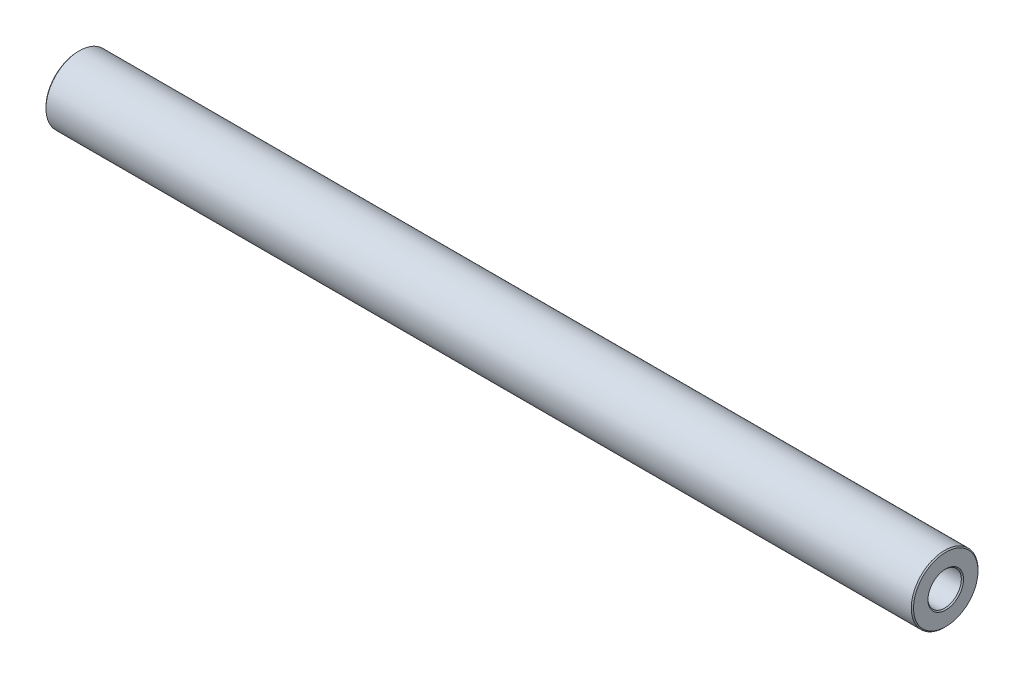
ISO-10303-21;
HEADER;
FILE_DESCRIPTION(('STEP AP214'),'2;1');
FILE_NAME('part.step','',(''),(''),'','','');
FILE_SCHEMA(('AUTOMOTIVE_DESIGN { 1 0 10303 214 1 1 1 1 }'));
ENDSEC;
DATA;
#1=APPLICATION_CONTEXT('core data for automotive mechanical design processes');
#2=APPLICATION_PROTOCOL_DEFINITION('international standard','automotive_design',2000,#1);
#3=PRODUCT_CONTEXT('',#1,'mechanical');
#4=PRODUCT('Part','Part','',(#3));
#5=PRODUCT_RELATED_PRODUCT_CATEGORY('part','',(#4));
#6=PRODUCT_DEFINITION_FORMATION('','',#4);
#7=PRODUCT_DEFINITION_CONTEXT('part definition',#1,'design');
#8=PRODUCT_DEFINITION('design','',#6,#7);
#9=PRODUCT_DEFINITION_SHAPE('','',#8);
#10=(LENGTH_UNIT() NAMED_UNIT(*) SI_UNIT(.MILLI.,.METRE.));
#11=(NAMED_UNIT(*) PLANE_ANGLE_UNIT() SI_UNIT($,.RADIAN.));
#12=(NAMED_UNIT(*) SI_UNIT($,.STERADIAN.) SOLID_ANGLE_UNIT());
#13=UNCERTAINTY_MEASURE_WITH_UNIT(LENGTH_MEASURE(1.E-05),#10,'distance_accuracy_value','');
#14=(GEOMETRIC_REPRESENTATION_CONTEXT(3) GLOBAL_UNCERTAINTY_ASSIGNED_CONTEXT((#13)) GLOBAL_UNIT_ASSIGNED_CONTEXT((#10,
#11,#12)) REPRESENTATION_CONTEXT('',''));
#15=CARTESIAN_POINT('',(0.,0.,0.));
#16=DIRECTION('',(0.,0.,1.));
#17=DIRECTION('',(1.,0.,0.));
#18=AXIS2_PLACEMENT_3D('',#15,#16,#17);
#19=CARTESIAN_POINT('',(39.,0.,0.));
#20=DIRECTION('',(-1.,0.,0.));
#21=DIRECTION('',(0.,0.,1.));
#22=AXIS2_PLACEMENT_3D('',#19,#20,#21);
#23=CYLINDRICAL_SURFACE('',#22,3.);
#24=CARTESIAN_POINT('',(-38.9,0.,0.));
#25=DIRECTION('',(1.,0.,0.));
#26=DIRECTION('',(0.,0.,-1.));
#27=AXIS2_PLACEMENT_3D('',#24,#25,#26);
#28=CIRCLE('',#27,3.);
#29=CARTESIAN_POINT('',(-38.9,0.,-3.));
#30=VERTEX_POINT('',#29);
#31=EDGE_CURVE('E49',#30,#30,#28,.T.);
#32=ORIENTED_EDGE('',*,*,#31,.T.);
#33=EDGE_LOOP('',(#32));
#34=FACE_BOUND('',#33,.T.);
#35=CARTESIAN_POINT('',(38.9,0.,0.));
#36=DIRECTION('',(1.,0.,0.));
#37=DIRECTION('',(0.,0.,-1.));
#38=AXIS2_PLACEMENT_3D('',#35,#36,#37);
#39=CIRCLE('',#38,3.);
#40=CARTESIAN_POINT('',(38.9,0.,-3.));
#41=VERTEX_POINT('',#40);
#42=EDGE_CURVE('E54',#41,#41,#39,.F.);
#43=ORIENTED_EDGE('',*,*,#42,.T.);
#44=EDGE_LOOP('',(#43));
#45=FACE_BOUND('',#44,.T.);
#46=ADVANCED_FACE('F33',(#34,#45),#23,.T.);
#47=CARTESIAN_POINT('',(39.,0.,0.));
#48=DIRECTION('',(1.,0.,0.));
#49=DIRECTION('',(0.,0.,-1.));
#50=AXIS2_PLACEMENT_3D('',#47,#48,#49);
#51=PLANE('',#50);
#52=CARTESIAN_POINT('',(39.,0.,0.));
#53=DIRECTION('',(1.,0.,0.));
#54=DIRECTION('',(0.,0.,-1.));
#55=AXIS2_PLACEMENT_3D('',#52,#53,#54);
#56=CIRCLE('',#55,1.59999999999999);
#57=CARTESIAN_POINT('',(39.,0.,-1.59999999999999));
#58=VERTEX_POINT('',#57);
#59=EDGE_CURVE('E10',#58,#58,#56,.F.);
#60=ORIENTED_EDGE('',*,*,#59,.T.);
#61=EDGE_LOOP('',(#60));
#62=FACE_BOUND('',#61,.T.);
#63=CARTESIAN_POINT('',(39.,0.,0.));
#64=DIRECTION('',(1.,0.,0.));
#65=DIRECTION('',(0.,0.,-1.));
#66=AXIS2_PLACEMENT_3D('',#63,#64,#65);
#67=CIRCLE('',#66,2.89999999999999);
#68=CARTESIAN_POINT('',(39.,0.,-2.89999999999999));
#69=VERTEX_POINT('',#68);
#70=EDGE_CURVE('E41',#69,#69,#67,.T.);
#71=ORIENTED_EDGE('',*,*,#70,.T.);
#72=EDGE_LOOP('',(#71));
#73=FACE_BOUND('',#72,.T.);
#74=ADVANCED_FACE('F90',(#62,#73),#51,.T.);
#75=CARTESIAN_POINT('',(-39.,0.,0.));
#76=DIRECTION('',(1.,0.,0.));
#77=DIRECTION('',(0.,0.,-1.));
#78=AXIS2_PLACEMENT_3D('',#75,#76,#77);
#79=PLANE('',#78);
#80=CARTESIAN_POINT('',(-39.,0.,0.));
#81=DIRECTION('',(1.,0.,0.));
#82=DIRECTION('',(0.,0.,-1.));
#83=AXIS2_PLACEMENT_3D('',#80,#81,#82);
#84=CIRCLE('',#83,1.59999999999999);
#85=CARTESIAN_POINT('',(-39.,0.,1.59999999999999));
#86=VERTEX_POINT('',#85);
#87=EDGE_CURVE('E57',#86,#86,#84,.T.);
#88=ORIENTED_EDGE('',*,*,#87,.T.);
#89=EDGE_LOOP('',(#88));
#90=FACE_BOUND('',#89,.T.);
#91=CARTESIAN_POINT('',(-39.,0.,0.));
#92=DIRECTION('',(1.,0.,0.));
#93=DIRECTION('',(0.,0.,-1.));
#94=AXIS2_PLACEMENT_3D('',#91,#92,#93);
#95=CIRCLE('',#94,2.90000000000001);
#96=CARTESIAN_POINT('',(-39.,0.,-2.90000000000001));
#97=VERTEX_POINT('',#96);
#98=EDGE_CURVE('E60',#97,#97,#95,.F.);
#99=ORIENTED_EDGE('',*,*,#98,.T.);
#100=EDGE_LOOP('',(#99));
#101=FACE_BOUND('',#100,.T.);
#102=ADVANCED_FACE('F96',(#90,#101),#79,.F.);
#103=CARTESIAN_POINT('',(-32.,0.,0.));
#104=DIRECTION('',(-1.,0.,0.));
#105=DIRECTION('',(0.,0.,1.));
#106=AXIS2_PLACEMENT_3D('',#103,#104,#105);
#107=CYLINDRICAL_SURFACE('',#106,1.5);
#108=CARTESIAN_POINT('',(-38.9,0.,0.));
#109=DIRECTION('',(1.,0.,0.));
#110=DIRECTION('',(0.,0.,-1.));
#111=AXIS2_PLACEMENT_3D('',#108,#109,#110);
#112=CIRCLE('',#111,1.5);
#113=CARTESIAN_POINT('',(-38.9,0.,1.5));
#114=VERTEX_POINT('',#113);
#115=EDGE_CURVE('E63',#114,#114,#112,.F.);
#116=ORIENTED_EDGE('',*,*,#115,.T.);
#117=EDGE_LOOP('',(#116));
#118=FACE_BOUND('',#117,.T.);
#119=CARTESIAN_POINT('',(-32.,0.,0.));
#120=DIRECTION('',(-1.,0.,0.));
#121=DIRECTION('',(0.,0.,1.));
#122=AXIS2_PLACEMENT_3D('',#119,#120,#121);
#123=CIRCLE('',#122,1.5);
#124=CARTESIAN_POINT('',(-32.,0.,1.5));
#125=VERTEX_POINT('',#124);
#126=EDGE_CURVE('E66',#125,#125,#123,.T.);
#127=ORIENTED_EDGE('',*,*,#126,.F.);
#128=EDGE_LOOP('',(#127));
#129=FACE_BOUND('',#128,.T.);
#130=ADVANCED_FACE('F86',(#118,#129),#107,.F.);
#131=CARTESIAN_POINT('',(-32.,0.,0.));
#132=DIRECTION('',(-1.,0.,0.));
#133=DIRECTION('',(0.,0.,1.));
#134=AXIS2_PLACEMENT_3D('',#131,#132,#133);
#135=PLANE('',#134);
#136=ORIENTED_EDGE('',*,*,#126,.T.);
#137=EDGE_LOOP('',(#136));
#138=FACE_BOUND('',#137,.T.);
#139=ADVANCED_FACE('F77',(#138),#135,.T.);
#140=CARTESIAN_POINT('',(32.,0.,0.));
#141=DIRECTION('',(1.,0.,0.));
#142=DIRECTION('',(0.,0.,-1.));
#143=AXIS2_PLACEMENT_3D('',#140,#141,#142);
#144=CYLINDRICAL_SURFACE('',#143,1.5);
#145=CARTESIAN_POINT('',(38.9,0.,0.));
#146=DIRECTION('',(1.,0.,0.));
#147=DIRECTION('',(0.,0.,-1.));
#148=AXIS2_PLACEMENT_3D('',#145,#146,#147);
#149=CIRCLE('',#148,1.5);
#150=CARTESIAN_POINT('',(38.9,0.,-1.5));
#151=VERTEX_POINT('',#150);
#152=EDGE_CURVE('E45',#151,#151,#149,.T.);
#153=ORIENTED_EDGE('',*,*,#152,.T.);
#154=EDGE_LOOP('',(#153));
#155=FACE_BOUND('',#154,.T.);
#156=CARTESIAN_POINT('',(32.,0.,0.));
#157=DIRECTION('',(1.,0.,0.));
#158=DIRECTION('',(0.,0.,-1.));
#159=AXIS2_PLACEMENT_3D('',#156,#157,#158);
#160=CIRCLE('',#159,1.5);
#161=CARTESIAN_POINT('',(32.,0.,-1.5));
#162=VERTEX_POINT('',#161);
#163=EDGE_CURVE('E69',#162,#162,#160,.T.);
#164=ORIENTED_EDGE('',*,*,#163,.F.);
#165=EDGE_LOOP('',(#164));
#166=FACE_BOUND('',#165,.T.);
#167=ADVANCED_FACE('F75',(#155,#166),#144,.F.);
#168=CARTESIAN_POINT('',(32.,0.,0.));
#169=DIRECTION('',(1.,0.,0.));
#170=DIRECTION('',(0.,0.,-1.));
#171=AXIS2_PLACEMENT_3D('',#168,#169,#170);
#172=PLANE('',#171);
#173=ORIENTED_EDGE('',*,*,#163,.T.);
#174=EDGE_LOOP('',(#173));
#175=FACE_BOUND('',#174,.T.);
#176=ADVANCED_FACE('F73',(#175),#172,.T.);
#177=CARTESIAN_POINT('',(-38.9,0.,0.));
#178=DIRECTION('',(-1.,0.,0.));
#179=DIRECTION('',(0.,0.,1.));
#180=AXIS2_PLACEMENT_3D('',#177,#178,#179);
#181=CONICAL_SURFACE('',#180,1.5,0.785398163397454);
#182=CARTESIAN_POINT('',(-39.,0.,1.59999999999999));
#183=CARTESIAN_POINT('',(-38.9989583333333,0.,1.59895833333333));
#184=CARTESIAN_POINT('',(-38.9979166666667,0.,1.59791666666666));
#185=CARTESIAN_POINT('',(-38.9958333333333,0.,1.59583333333333));
#186=CARTESIAN_POINT('',(-38.9947916666667,0.,1.59479166666666));
#187=CARTESIAN_POINT('',(-38.9927083333333,0.,1.59270833333333));
#188=CARTESIAN_POINT('',(-38.9916666666667,0.,1.59166666666666));
#189=CARTESIAN_POINT('',(-38.9895833333333,0.,1.58958333333333));
#190=CARTESIAN_POINT('',(-38.9885416666667,0.,1.58854166666666));
#191=CARTESIAN_POINT('',(-38.9864583333333,0.,1.58645833333333));
#192=CARTESIAN_POINT('',(-38.9854166666667,0.,1.58541666666666));
#193=CARTESIAN_POINT('',(-38.9833333333333,0.,1.58333333333333));
#194=CARTESIAN_POINT('',(-38.9822916666667,0.,1.58229166666666));
#195=CARTESIAN_POINT('',(-38.9802083333333,0.,1.58020833333333));
#196=CARTESIAN_POINT('',(-38.9791666666667,0.,1.57916666666666));
#197=CARTESIAN_POINT('',(-38.9770833333333,0.,1.57708333333333));
#198=CARTESIAN_POINT('',(-38.9760416666667,0.,1.57604166666666));
#199=CARTESIAN_POINT('',(-38.9739583333333,0.,1.57395833333333));
#200=CARTESIAN_POINT('',(-38.9729166666667,0.,1.57291666666666));
#201=CARTESIAN_POINT('',(-38.9708333333333,0.,1.57083333333333));
#202=CARTESIAN_POINT('',(-38.9697916666667,0.,1.56979166666666));
#203=CARTESIAN_POINT('',(-38.9677083333333,0.,1.56770833333333));
#204=CARTESIAN_POINT('',(-38.9666666666667,0.,1.56666666666666));
#205=CARTESIAN_POINT('',(-38.9645833333333,0.,1.56458333333333));
#206=CARTESIAN_POINT('',(-38.9635416666667,0.,1.56354166666666));
#207=CARTESIAN_POINT('',(-38.9614583333333,0.,1.56145833333333));
#208=CARTESIAN_POINT('',(-38.9604166666667,0.,1.56041666666666));
#209=CARTESIAN_POINT('',(-38.9583333333333,0.,1.55833333333333));
#210=CARTESIAN_POINT('',(-38.9572916666667,0.,1.55729166666666));
#211=CARTESIAN_POINT('',(-38.9552083333333,0.,1.55520833333333));
#212=CARTESIAN_POINT('',(-38.9541666666667,0.,1.55416666666667));
#213=CARTESIAN_POINT('',(-38.9520833333333,0.,1.55208333333333));
#214=CARTESIAN_POINT('',(-38.9510416666667,0.,1.55104166666667));
#215=CARTESIAN_POINT('',(-38.9489583333333,0.,1.54895833333333));
#216=CARTESIAN_POINT('',(-38.9479166666667,0.,1.54791666666667));
#217=CARTESIAN_POINT('',(-38.9458333333333,0.,1.54583333333333));
#218=CARTESIAN_POINT('',(-38.9447916666667,0.,1.54479166666667));
#219=CARTESIAN_POINT('',(-38.9427083333333,0.,1.54270833333333));
#220=CARTESIAN_POINT('',(-38.9416666666667,0.,1.54166666666667));
#221=CARTESIAN_POINT('',(-38.9395833333333,0.,1.53958333333333));
#222=CARTESIAN_POINT('',(-38.9385416666667,0.,1.53854166666667));
#223=CARTESIAN_POINT('',(-38.9364583333333,0.,1.53645833333333));
#224=CARTESIAN_POINT('',(-38.9354166666667,0.,1.53541666666667));
#225=CARTESIAN_POINT('',(-38.9333333333333,0.,1.53333333333333));
#226=CARTESIAN_POINT('',(-38.9322916666667,0.,1.53229166666667));
#227=CARTESIAN_POINT('',(-38.9302083333333,0.,1.53020833333333));
#228=CARTESIAN_POINT('',(-38.9291666666667,0.,1.52916666666667));
#229=CARTESIAN_POINT('',(-38.9270833333333,0.,1.52708333333333));
#230=CARTESIAN_POINT('',(-38.9260416666667,0.,1.52604166666667));
#231=CARTESIAN_POINT('',(-38.9239583333333,0.,1.52395833333333));
#232=CARTESIAN_POINT('',(-38.9229166666667,0.,1.52291666666667));
#233=CARTESIAN_POINT('',(-38.9208333333333,0.,1.52083333333334));
#234=CARTESIAN_POINT('',(-38.9197916666667,0.,1.51979166666667));
#235=CARTESIAN_POINT('',(-38.9177083333333,0.,1.51770833333334));
#236=CARTESIAN_POINT('',(-38.9166666666667,0.,1.51666666666667));
#237=CARTESIAN_POINT('',(-38.9145833333333,0.,1.51458333333334));
#238=CARTESIAN_POINT('',(-38.9135416666667,0.,1.51354166666667));
#239=CARTESIAN_POINT('',(-38.9114583333333,0.,1.51145833333334));
#240=CARTESIAN_POINT('',(-38.9104166666667,0.,1.51041666666667));
#241=CARTESIAN_POINT('',(-38.9083333333333,0.,1.50833333333334));
#242=CARTESIAN_POINT('',(-38.9072916666667,0.,1.50729166666667));
#243=CARTESIAN_POINT('',(-38.9052083333333,0.,1.50520833333334));
#244=CARTESIAN_POINT('',(-38.9041666666667,0.,1.50416666666667));
#245=CARTESIAN_POINT('',(-38.9020833333333,0.,1.50208333333334));
#246=CARTESIAN_POINT('',(-38.9010416666667,0.,1.50104166666667));
#247=CARTESIAN_POINT('',(-38.9,0.,1.5));
#248=B_SPLINE_CURVE_WITH_KNOTS('',3,(#182,#183,#184,#185,#186,#187,#188,#189,#190,#191,#192,
#193,#194,#195,#196,#197,#198,#199,#200,#201,#202,#203,#204,#205,#206,#207,#208,#209,#210,#211,
#212,#213,#214,#215,#216,#217,#218,#219,#220,#221,#222,#223,#224,#225,#226,#227,#228,#229,#230,
#231,#232,#233,#234,#235,#236,#237,#238,#239,#240,#241,#242,#243,#244,#245,#246,#247),
.UNSPECIFIED.,.F.,.F.,(4,2,2,2,2,2,2,2,2,2,2,2,2,2,2,2,2,2,2,2,2,2,2,2,2,2,2,2,2,2,2,2,4),(0.,
0.00441941738241544,0.00883883476483087,0.0132582521472463,0.0176776695296619,
0.0220970869120773,0.0265165042944928,0.0309359216769082,0.0353553390593236,0.0397747564417391,
0.0441941738241547,0.0486135912065701,0.0530330085889855,0.057452425971401,0.0618718433538164,
0.0662912607362318,0.0707106781186473,0.0751300955010629,0.0795495128834783,0.0839689302658937,
0.0883883476483092,0.0928077650307246,0.0972271824131401,0.101646599795556,0.106066017177971,
0.110485434560387,0.114904851942802,0.119324269325217,0.123743686707633,0.128163104090048,
0.132582521472464,0.137001938854879,0.141421356237295),.UNSPECIFIED.);
#249=EDGE_CURVE('BSEAM84',#86,#114,#248,.T.);
#250=ORIENTED_EDGE('',*,*,#87,.F.);
#251=ORIENTED_EDGE('',*,*,#115,.F.);
#252=ORIENTED_EDGE('',*,*,#249,.T.);
#253=ORIENTED_EDGE('',*,*,#249,.F.);
#254=EDGE_LOOP('',(#250,#252,#251,#253));
#255=FACE_BOUND('',#254,.T.);
#256=ADVANCED_FACE('F84',(#255),#181,.F.);
#257=CARTESIAN_POINT('',(-38.9,0.,0.));
#258=DIRECTION('',(1.,0.,0.));
#259=DIRECTION('',(0.,0.,-1.));
#260=AXIS2_PLACEMENT_3D('',#257,#258,#259);
#261=CONICAL_SURFACE('',#260,3.,0.785398163397438);
#262=CARTESIAN_POINT('',(-39.,0.,-2.90000000000001));
#263=CARTESIAN_POINT('',(-38.9989583333333,0.,-2.90104166666668));
#264=CARTESIAN_POINT('',(-38.9979166666667,0.,-2.90208333333334));
#265=CARTESIAN_POINT('',(-38.9958333333333,0.,-2.90416666666668));
#266=CARTESIAN_POINT('',(-38.9947916666667,0.,-2.90520833333334));
#267=CARTESIAN_POINT('',(-38.9927083333333,0.,-2.90729166666668));
#268=CARTESIAN_POINT('',(-38.9916666666667,0.,-2.90833333333334));
#269=CARTESIAN_POINT('',(-38.9895833333333,0.,-2.91041666666668));
#270=CARTESIAN_POINT('',(-38.9885416666667,0.,-2.91145833333334));
#271=CARTESIAN_POINT('',(-38.9864583333333,0.,-2.91354166666668));
#272=CARTESIAN_POINT('',(-38.9854166666667,0.,-2.91458333333334));
#273=CARTESIAN_POINT('',(-38.9833333333333,0.,-2.91666666666667));
#274=CARTESIAN_POINT('',(-38.9822916666667,0.,-2.91770833333334));
#275=CARTESIAN_POINT('',(-38.9802083333333,0.,-2.91979166666667));
#276=CARTESIAN_POINT('',(-38.9791666666667,0.,-2.92083333333334));
#277=CARTESIAN_POINT('',(-38.9770833333333,0.,-2.92291666666667));
#278=CARTESIAN_POINT('',(-38.9760416666667,0.,-2.92395833333334));
#279=CARTESIAN_POINT('',(-38.9739583333333,0.,-2.92604166666667));
#280=CARTESIAN_POINT('',(-38.9729166666667,0.,-2.92708333333334));
#281=CARTESIAN_POINT('',(-38.9708333333333,0.,-2.92916666666667));
#282=CARTESIAN_POINT('',(-38.9697916666667,0.,-2.93020833333334));
#283=CARTESIAN_POINT('',(-38.9677083333333,0.,-2.93229166666667));
#284=CARTESIAN_POINT('',(-38.9666666666667,0.,-2.93333333333334));
#285=CARTESIAN_POINT('',(-38.9645833333333,0.,-2.93541666666667));
#286=CARTESIAN_POINT('',(-38.9635416666667,0.,-2.93645833333334));
#287=CARTESIAN_POINT('',(-38.9614583333333,0.,-2.93854166666667));
#288=CARTESIAN_POINT('',(-38.9604166666667,0.,-2.93958333333334));
#289=CARTESIAN_POINT('',(-38.9583333333333,0.,-2.94166666666667));
#290=CARTESIAN_POINT('',(-38.9572916666667,0.,-2.94270833333334));
#291=CARTESIAN_POINT('',(-38.9552083333333,0.,-2.94479166666667));
#292=CARTESIAN_POINT('',(-38.9541666666667,0.,-2.94583333333334));
#293=CARTESIAN_POINT('',(-38.9520833333333,0.,-2.94791666666667));
#294=CARTESIAN_POINT('',(-38.9510416666667,0.,-2.94895833333334));
#295=CARTESIAN_POINT('',(-38.9489583333333,0.,-2.95104166666667));
#296=CARTESIAN_POINT('',(-38.9479166666667,0.,-2.95208333333334));
#297=CARTESIAN_POINT('',(-38.9458333333333,0.,-2.95416666666667));
#298=CARTESIAN_POINT('',(-38.9447916666667,0.,-2.95520833333334));
#299=CARTESIAN_POINT('',(-38.9427083333333,0.,-2.95729166666667));
#300=CARTESIAN_POINT('',(-38.9416666666667,0.,-2.95833333333334));
#301=CARTESIAN_POINT('',(-38.9395833333333,0.,-2.96041666666667));
#302=CARTESIAN_POINT('',(-38.9385416666667,0.,-2.96145833333334));
#303=CARTESIAN_POINT('',(-38.9364583333333,0.,-2.96354166666667));
#304=CARTESIAN_POINT('',(-38.9354166666667,0.,-2.96458333333334));
#305=CARTESIAN_POINT('',(-38.9333333333333,0.,-2.96666666666667));
#306=CARTESIAN_POINT('',(-38.9322916666667,0.,-2.96770833333333));
#307=CARTESIAN_POINT('',(-38.9302083333333,0.,-2.96979166666667));
#308=CARTESIAN_POINT('',(-38.9291666666667,0.,-2.97083333333333));
#309=CARTESIAN_POINT('',(-38.9270833333333,0.,-2.97291666666667));
#310=CARTESIAN_POINT('',(-38.9260416666667,0.,-2.97395833333333));
#311=CARTESIAN_POINT('',(-38.9239583333333,0.,-2.97604166666667));
#312=CARTESIAN_POINT('',(-38.9229166666667,0.,-2.97708333333333));
#313=CARTESIAN_POINT('',(-38.9208333333333,0.,-2.97916666666667));
#314=CARTESIAN_POINT('',(-38.9197916666667,0.,-2.98020833333333));
#315=CARTESIAN_POINT('',(-38.9177083333333,0.,-2.98229166666667));
#316=CARTESIAN_POINT('',(-38.9166666666667,0.,-2.98333333333333));
#317=CARTESIAN_POINT('',(-38.9145833333333,0.,-2.98541666666667));
#318=CARTESIAN_POINT('',(-38.9135416666667,0.,-2.98645833333333));
#319=CARTESIAN_POINT('',(-38.9114583333333,0.,-2.98854166666667));
#320=CARTESIAN_POINT('',(-38.9104166666667,0.,-2.98958333333333));
#321=CARTESIAN_POINT('',(-38.9083333333333,0.,-2.99166666666666));
#322=CARTESIAN_POINT('',(-38.9072916666667,0.,-2.99270833333333));
#323=CARTESIAN_POINT('',(-38.9052083333333,0.,-2.99479166666666));
#324=CARTESIAN_POINT('',(-38.9041666666667,0.,-2.99583333333333));
#325=CARTESIAN_POINT('',(-38.9020833333333,0.,-2.99791666666666));
#326=CARTESIAN_POINT('',(-38.9010416666667,0.,-2.99895833333333));
#327=CARTESIAN_POINT('',(-38.9,0.,-3.));
#328=B_SPLINE_CURVE_WITH_KNOTS('',3,(#262,#263,#264,#265,#266,#267,#268,#269,#270,#271,#272,
#273,#274,#275,#276,#277,#278,#279,#280,#281,#282,#283,#284,#285,#286,#287,#288,#289,#290,#291,
#292,#293,#294,#295,#296,#297,#298,#299,#300,#301,#302,#303,#304,#305,#306,#307,#308,#309,#310,
#311,#312,#313,#314,#315,#316,#317,#318,#319,#320,#321,#322,#323,#324,#325,#326,#327),
.UNSPECIFIED.,.F.,.F.,(4,2,2,2,2,2,2,2,2,2,2,2,2,2,2,2,2,2,2,2,2,2,2,2,2,2,2,2,2,2,2,2,4),(0.,
0.00441941738241544,0.00883883476483087,0.0132582521472463,0.0176776695296614,
0.0220970869120769,0.0265165042944923,0.0309359216769077,0.0353553390593232,0.0397747564417386,
0.0441941738241537,0.0486135912065692,0.0530330085889846,0.0574524259714,0.0618718433538155,
0.0662912607362309,0.0707106781186464,0.0751300955010615,0.0795495128834769,0.0839689302658924,
0.0883883476483078,0.0928077650307232,0.0972271824131387,0.101646599795554,0.106066017177969,
0.110485434560385,0.1149048519428,0.119324269325216,0.123743686707631,0.128163104090046,
0.132582521472462,0.137001938854877,0.141421356237292),.UNSPECIFIED.);
#329=EDGE_CURVE('BSEAM107',#97,#30,#328,.T.);
#330=ORIENTED_EDGE('',*,*,#98,.F.);
#331=ORIENTED_EDGE('',*,*,#31,.F.);
#332=ORIENTED_EDGE('',*,*,#329,.T.);
#333=ORIENTED_EDGE('',*,*,#329,.F.);
#334=EDGE_LOOP('',(#330,#332,#331,#333));
#335=FACE_BOUND('',#334,.T.);
#336=ADVANCED_FACE('F107',(#335),#261,.T.);
#337=CARTESIAN_POINT('',(38.9,0.,0.));
#338=DIRECTION('',(1.,0.,0.));
#339=DIRECTION('',(0.,0.,-1.));
#340=AXIS2_PLACEMENT_3D('',#337,#338,#339);
#341=CONICAL_SURFACE('',#340,1.5,0.785398163397454);
#342=CARTESIAN_POINT('',(39.,0.,-1.59999999999999));
#343=CARTESIAN_POINT('',(38.9989583333333,0.,-1.59895833333332));
#344=CARTESIAN_POINT('',(38.9979166666667,0.,-1.59791666666665));
#345=CARTESIAN_POINT('',(38.9958333333333,0.,-1.59583333333332));
#346=CARTESIAN_POINT('',(38.9947916666667,0.,-1.59479166666665));
#347=CARTESIAN_POINT('',(38.9927083333333,0.,-1.59270833333332));
#348=CARTESIAN_POINT('',(38.9916666666667,0.,-1.59166666666665));
#349=CARTESIAN_POINT('',(38.9895833333333,0.,-1.58958333333332));
#350=CARTESIAN_POINT('',(38.9885416666667,0.,-1.58854166666665));
#351=CARTESIAN_POINT('',(38.9864583333333,0.,-1.58645833333332));
#352=CARTESIAN_POINT('',(38.9854166666667,0.,-1.58541666666665));
#353=CARTESIAN_POINT('',(38.9833333333333,0.,-1.58333333333332));
#354=CARTESIAN_POINT('',(38.9822916666667,0.,-1.58229166666666));
#355=CARTESIAN_POINT('',(38.9802083333333,0.,-1.58020833333332));
#356=CARTESIAN_POINT('',(38.9791666666667,0.,-1.57916666666666));
#357=CARTESIAN_POINT('',(38.9770833333333,0.,-1.57708333333332));
#358=CARTESIAN_POINT('',(38.9760416666667,0.,-1.57604166666666));
#359=CARTESIAN_POINT('',(38.9739583333333,0.,-1.57395833333332));
#360=CARTESIAN_POINT('',(38.9729166666667,0.,-1.57291666666666));
#361=CARTESIAN_POINT('',(38.9708333333333,0.,-1.57083333333332));
#362=CARTESIAN_POINT('',(38.9697916666667,0.,-1.56979166666666));
#363=CARTESIAN_POINT('',(38.9677083333333,0.,-1.56770833333332));
#364=CARTESIAN_POINT('',(38.9666666666667,0.,-1.56666666666666));
#365=CARTESIAN_POINT('',(38.9645833333333,0.,-1.56458333333332));
#366=CARTESIAN_POINT('',(38.9635416666667,0.,-1.56354166666666));
#367=CARTESIAN_POINT('',(38.9614583333333,0.,-1.56145833333333));
#368=CARTESIAN_POINT('',(38.9604166666667,0.,-1.56041666666666));
#369=CARTESIAN_POINT('',(38.9583333333333,0.,-1.55833333333332));
#370=CARTESIAN_POINT('',(38.9572916666667,0.,-1.55729166666666));
#371=CARTESIAN_POINT('',(38.9552083333333,0.,-1.55520833333332));
#372=CARTESIAN_POINT('',(38.9541666666667,0.,-1.55416666666666));
#373=CARTESIAN_POINT('',(38.9520833333333,0.,-1.55208333333333));
#374=CARTESIAN_POINT('',(38.9510416666667,0.,-1.55104166666666));
#375=CARTESIAN_POINT('',(38.9489583333333,0.,-1.54895833333333));
#376=CARTESIAN_POINT('',(38.9479166666667,0.,-1.54791666666666));
#377=CARTESIAN_POINT('',(38.9458333333333,0.,-1.54583333333333));
#378=CARTESIAN_POINT('',(38.9447916666667,0.,-1.54479166666666));
#379=CARTESIAN_POINT('',(38.9427083333333,0.,-1.54270833333333));
#380=CARTESIAN_POINT('',(38.9416666666667,0.,-1.54166666666666));
#381=CARTESIAN_POINT('',(38.9395833333333,0.,-1.53958333333333));
#382=CARTESIAN_POINT('',(38.9385416666667,0.,-1.53854166666666));
#383=CARTESIAN_POINT('',(38.9364583333333,0.,-1.53645833333333));
#384=CARTESIAN_POINT('',(38.9354166666667,0.,-1.53541666666666));
#385=CARTESIAN_POINT('',(38.9333333333333,0.,-1.53333333333333));
#386=CARTESIAN_POINT('',(38.9322916666667,0.,-1.53229166666666));
#387=CARTESIAN_POINT('',(38.9302083333333,0.,-1.53020833333333));
#388=CARTESIAN_POINT('',(38.9291666666667,0.,-1.52916666666666));
#389=CARTESIAN_POINT('',(38.9270833333333,0.,-1.52708333333333));
#390=CARTESIAN_POINT('',(38.9260416666667,0.,-1.52604166666666));
#391=CARTESIAN_POINT('',(38.9239583333333,0.,-1.52395833333333));
#392=CARTESIAN_POINT('',(38.9229166666667,0.,-1.52291666666666));
#393=CARTESIAN_POINT('',(38.9208333333333,0.,-1.52083333333333));
#394=CARTESIAN_POINT('',(38.9197916666667,0.,-1.51979166666666));
#395=CARTESIAN_POINT('',(38.9177083333333,0.,-1.51770833333333));
#396=CARTESIAN_POINT('',(38.9166666666667,0.,-1.51666666666666));
#397=CARTESIAN_POINT('',(38.9145833333333,0.,-1.51458333333333));
#398=CARTESIAN_POINT('',(38.9135416666667,0.,-1.51354166666666));
#399=CARTESIAN_POINT('',(38.9114583333333,0.,-1.51145833333333));
#400=CARTESIAN_POINT('',(38.9104166666667,0.,-1.51041666666666));
#401=CARTESIAN_POINT('',(38.9083333333333,0.,-1.50833333333333));
#402=CARTESIAN_POINT('',(38.9072916666667,0.,-1.50729166666666));
#403=CARTESIAN_POINT('',(38.9052083333333,0.,-1.50520833333333));
#404=CARTESIAN_POINT('',(38.9041666666667,0.,-1.50416666666666));
#405=CARTESIAN_POINT('',(38.9020833333333,0.,-1.50208333333333));
#406=CARTESIAN_POINT('',(38.9010416666667,0.,-1.50104166666666));
#407=CARTESIAN_POINT('',(38.9,0.,-1.5));
#408=B_SPLINE_CURVE_WITH_KNOTS('',3,(#342,#343,#344,#345,#346,#347,#348,#349,#350,#351,#352,
#353,#354,#355,#356,#357,#358,#359,#360,#361,#362,#363,#364,#365,#366,#367,#368,#369,#370,#371,
#372,#373,#374,#375,#376,#377,#378,#379,#380,#381,#382,#383,#384,#385,#386,#387,#388,#389,#390,
#391,#392,#393,#394,#395,#396,#397,#398,#399,#400,#401,#402,#403,#404,#405,#406,#407),
.UNSPECIFIED.,.F.,.F.,(4,2,2,2,2,2,2,2,2,2,2,2,2,2,2,2,2,2,2,2,2,2,2,2,2,2,2,2,2,2,2,2,4),(0.,
0.00441941738241544,0.00883883476483087,0.0132582521472463,0.0176776695296617,
0.0220970869120773,0.0265165042944928,0.0309359216769082,0.0353553390593236,0.0397747564417391,
0.0441941738241545,0.0486135912065701,0.0530330085889904,0.057452425971401,0.0618718433538164,
0.0662912607362318,0.0707106781186473,0.0751300955010629,0.0795495128834783,0.0839689302658937,
0.0883883476483092,0.0928077650307246,0.0972271824131401,0.101646599795556,0.106066017177976,
0.110485434560391,0.114904851942807,0.119324269325222,0.123743686707638,0.128163104090053,
0.132582521472469,0.137001938854884,0.141421356237295),.UNSPECIFIED.);
#409=EDGE_CURVE('BSEAM113',#58,#151,#408,.T.);
#410=ORIENTED_EDGE('',*,*,#59,.F.);
#411=ORIENTED_EDGE('',*,*,#152,.F.);
#412=ORIENTED_EDGE('',*,*,#409,.T.);
#413=ORIENTED_EDGE('',*,*,#409,.F.);
#414=EDGE_LOOP('',(#410,#412,#411,#413));
#415=FACE_BOUND('',#414,.T.);
#416=ADVANCED_FACE('F113',(#415),#341,.F.);
#417=CARTESIAN_POINT('',(39.,0.,0.));
#418=DIRECTION('',(-1.,0.,0.));
#419=DIRECTION('',(0.,0.,1.));
#420=AXIS2_PLACEMENT_3D('',#417,#418,#419);
#421=CONICAL_SURFACE('',#420,2.89999999999999,0.785398163397474);
#422=ORIENTED_EDGE('',*,*,#42,.F.);
#423=EDGE_LOOP('',(#422));
#424=FACE_BOUND('',#423,.T.);
#425=ORIENTED_EDGE('',*,*,#70,.F.);
#426=EDGE_LOOP('',(#425));
#427=FACE_BOUND('',#426,.T.);
#428=ADVANCED_FACE('F36',(#424,#427),#421,.T.);
#429=CLOSED_SHELL('',(#46,#74,#102,#130,#139,#167,#176,#256,#336,#416,#428));
#430=MANIFOLD_SOLID_BREP('B2',#429);
#431=ADVANCED_BREP_SHAPE_REPRESENTATION('',(#18,#430),#14);
#432=SHAPE_DEFINITION_REPRESENTATION(#9,#431);
ENDSEC;
END-ISO-10303-21;
